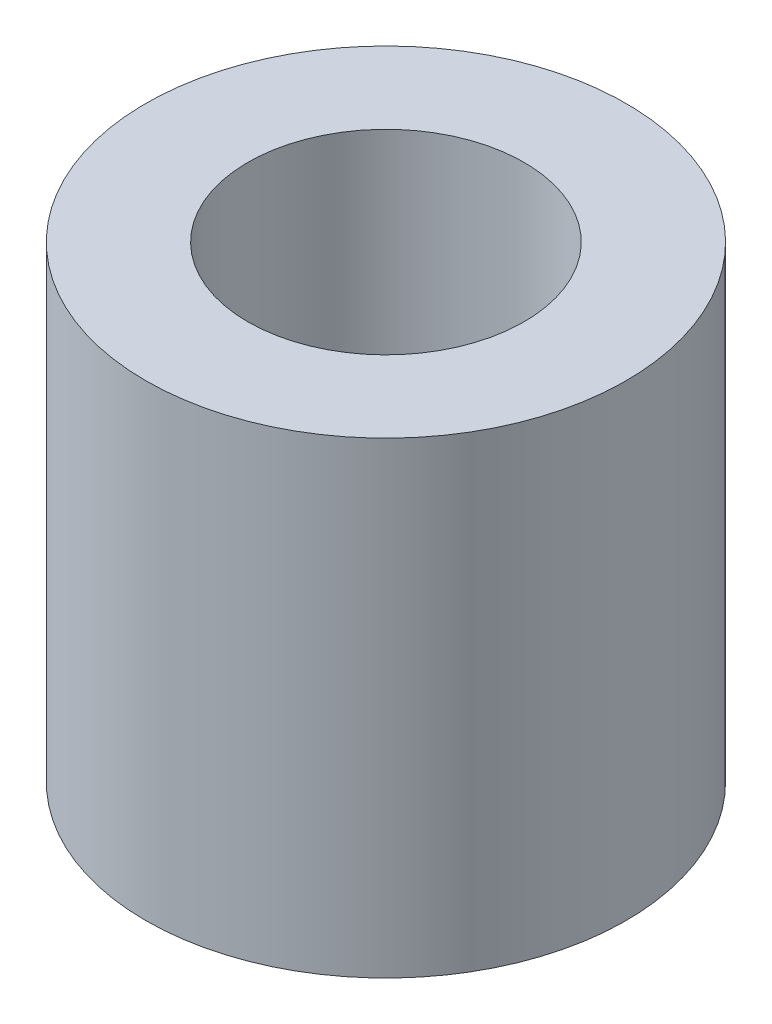
ISO-10303-21;
HEADER;
FILE_DESCRIPTION(('STEP AP214'),'2;1');
FILE_NAME('part.step','',(''),(''),'','','');
FILE_SCHEMA(('AUTOMOTIVE_DESIGN { 1 0 10303 214 1 1 1 1 }'));
ENDSEC;
DATA;
#1=APPLICATION_CONTEXT('core data for automotive mechanical design processes');
#2=APPLICATION_PROTOCOL_DEFINITION('international standard','automotive_design',2000,#1);
#3=PRODUCT_CONTEXT('',#1,'mechanical');
#4=PRODUCT('Part','Part','',(#3));
#5=PRODUCT_RELATED_PRODUCT_CATEGORY('part','',(#4));
#6=PRODUCT_DEFINITION_FORMATION('','',#4);
#7=PRODUCT_DEFINITION_CONTEXT('part definition',#1,'design');
#8=PRODUCT_DEFINITION('design','',#6,#7);
#9=PRODUCT_DEFINITION_SHAPE('','',#8);
#10=(LENGTH_UNIT() NAMED_UNIT(*) SI_UNIT(.MILLI.,.METRE.));
#11=(NAMED_UNIT(*) PLANE_ANGLE_UNIT() SI_UNIT($,.RADIAN.));
#12=(NAMED_UNIT(*) SI_UNIT($,.STERADIAN.) SOLID_ANGLE_UNIT());
#13=UNCERTAINTY_MEASURE_WITH_UNIT(LENGTH_MEASURE(1.E-05),#10,'distance_accuracy_value','');
#14=(GEOMETRIC_REPRESENTATION_CONTEXT(3) GLOBAL_UNCERTAINTY_ASSIGNED_CONTEXT((#13)) GLOBAL_UNIT_ASSIGNED_CONTEXT((#10,
#11,#12)) REPRESENTATION_CONTEXT('',''));
#15=CARTESIAN_POINT('',(0.,0.,0.));
#16=DIRECTION('',(0.,0.,1.));
#17=DIRECTION('',(1.,0.,0.));
#18=AXIS2_PLACEMENT_3D('',#15,#16,#17);
#19=CARTESIAN_POINT('',(0.,11.,0.));
#20=DIRECTION('',(0.,1.,0.));
#21=DIRECTION('',(0.,0.,1.));
#22=AXIS2_PLACEMENT_3D('',#19,#20,#21);
#23=PLANE('',#22);
#24=CARTESIAN_POINT('',(0.,11.,0.));
#25=DIRECTION('',(0.,1.,0.));
#26=DIRECTION('',(0.,0.,1.));
#27=AXIS2_PLACEMENT_3D('',#24,#25,#26);
#28=CIRCLE('',#27,5.65);
#29=CARTESIAN_POINT('',(0.,11.,5.65));
#30=VERTEX_POINT('',#29);
#31=EDGE_CURVE('E10',#30,#30,#28,.T.);
#32=ORIENTED_EDGE('',*,*,#31,.T.);
#33=EDGE_LOOP('',(#32));
#34=FACE_BOUND('',#33,.T.);
#35=CARTESIAN_POINT('',(0.,11.,0.));
#36=DIRECTION('',(0.,1.,0.));
#37=DIRECTION('',(0.,0.,1.));
#38=AXIS2_PLACEMENT_3D('',#35,#36,#37);
#39=CIRCLE('',#38,3.25);
#40=CARTESIAN_POINT('',(0.,11.,3.25));
#41=VERTEX_POINT('',#40);
#42=EDGE_CURVE('E46',#41,#41,#39,.T.);
#43=ORIENTED_EDGE('',*,*,#42,.F.);
#44=EDGE_LOOP('',(#43));
#45=FACE_BOUND('',#44,.T.);
#46=ADVANCED_FACE('F35',(#34,#45),#23,.T.);
#47=CARTESIAN_POINT('',(0.,0.,0.));
#48=DIRECTION('',(0.,1.,0.));
#49=DIRECTION('',(0.,0.,1.));
#50=AXIS2_PLACEMENT_3D('',#47,#48,#49);
#51=PLANE('',#50);
#52=CARTESIAN_POINT('',(0.,0.,0.));
#53=DIRECTION('',(0.,1.,0.));
#54=DIRECTION('',(0.,0.,1.));
#55=AXIS2_PLACEMENT_3D('',#52,#53,#54);
#56=CIRCLE('',#55,5.65);
#57=CARTESIAN_POINT('',(0.,0.,5.65));
#58=VERTEX_POINT('',#57);
#59=EDGE_CURVE('E39',#58,#58,#56,.T.);
#60=ORIENTED_EDGE('',*,*,#59,.F.);
#61=EDGE_LOOP('',(#60));
#62=FACE_BOUND('',#61,.T.);
#63=CARTESIAN_POINT('',(0.,0.,0.));
#64=DIRECTION('',(0.,1.,0.));
#65=DIRECTION('',(0.,0.,1.));
#66=AXIS2_PLACEMENT_3D('',#63,#64,#65);
#67=CIRCLE('',#66,3.25);
#68=CARTESIAN_POINT('',(0.,0.,3.25));
#69=VERTEX_POINT('',#68);
#70=EDGE_CURVE('E48',#69,#69,#67,.T.);
#71=ORIENTED_EDGE('',*,*,#70,.T.);
#72=EDGE_LOOP('',(#71));
#73=FACE_BOUND('',#72,.T.);
#74=ADVANCED_FACE('F58',(#62,#73),#51,.F.);
#75=CARTESIAN_POINT('',(0.,11.,0.));
#76=DIRECTION('',(0.,-1.,0.));
#77=DIRECTION('',(0.,0.,-1.));
#78=AXIS2_PLACEMENT_3D('',#75,#76,#77);
#79=CYLINDRICAL_SURFACE('',#78,5.65);
#80=ORIENTED_EDGE('',*,*,#31,.F.);
#81=EDGE_LOOP('',(#80));
#82=FACE_BOUND('',#81,.T.);
#83=ORIENTED_EDGE('',*,*,#59,.T.);
#84=EDGE_LOOP('',(#83));
#85=FACE_BOUND('',#84,.T.);
#86=ADVANCED_FACE('F37',(#82,#85),#79,.T.);
#87=CARTESIAN_POINT('',(0.,11.,0.));
#88=DIRECTION('',(0.,-1.,0.));
#89=DIRECTION('',(0.,0.,-1.));
#90=AXIS2_PLACEMENT_3D('',#87,#88,#89);
#91=CYLINDRICAL_SURFACE('',#90,3.25);
#92=ORIENTED_EDGE('',*,*,#42,.T.);
#93=EDGE_LOOP('',(#92));
#94=FACE_BOUND('',#93,.T.);
#95=ORIENTED_EDGE('',*,*,#70,.F.);
#96=EDGE_LOOP('',(#95));
#97=FACE_BOUND('',#96,.T.);
#98=ADVANCED_FACE('F54',(#94,#97),#91,.F.);
#99=CLOSED_SHELL('',(#46,#74,#86,#98));
#100=MANIFOLD_SOLID_BREP('B2',#99);
#101=ADVANCED_BREP_SHAPE_REPRESENTATION('',(#18,#100),#14);
#102=SHAPE_DEFINITION_REPRESENTATION(#9,#101);
ENDSEC;
END-ISO-10303-21;
